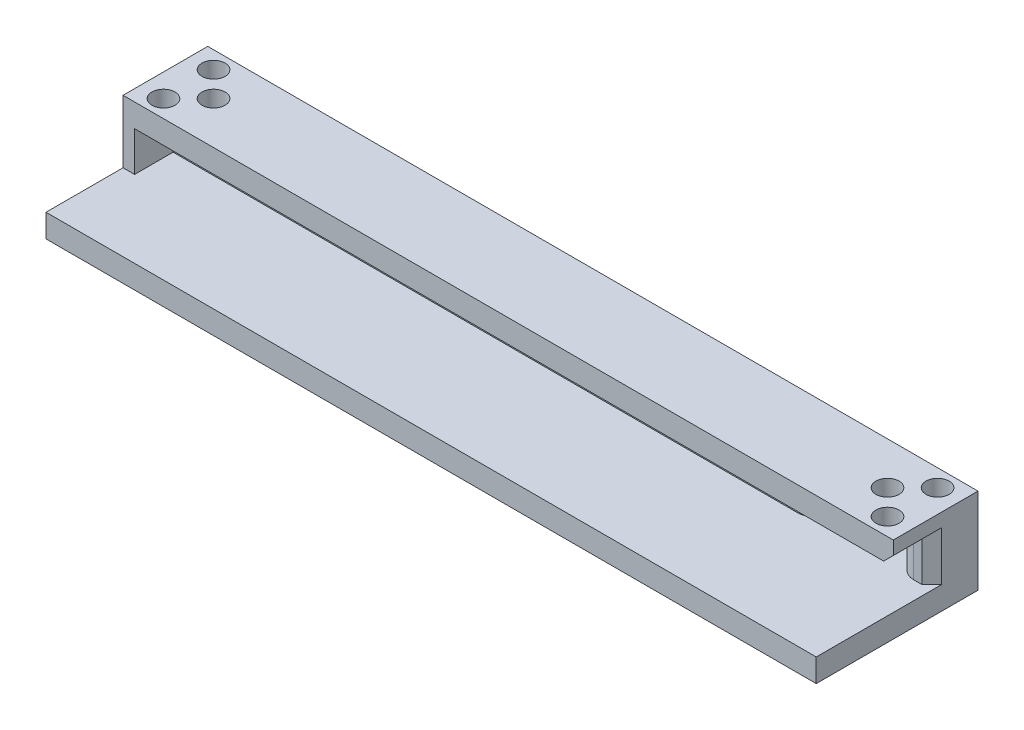
ISO-10303-21;
HEADER;
FILE_DESCRIPTION(('STEP AP214'),'2;1');
FILE_NAME('part.step','',(''),(''),'','','');
FILE_SCHEMA(('AUTOMOTIVE_DESIGN { 1 0 10303 214 1 1 1 1 }'));
ENDSEC;
DATA;
#1=APPLICATION_CONTEXT('core data for automotive mechanical design processes');
#2=APPLICATION_PROTOCOL_DEFINITION('international standard','automotive_design',2000,#1);
#3=PRODUCT_CONTEXT('',#1,'mechanical');
#4=PRODUCT('Part','Part','',(#3));
#5=PRODUCT_RELATED_PRODUCT_CATEGORY('part','',(#4));
#6=PRODUCT_DEFINITION_FORMATION('','',#4);
#7=PRODUCT_DEFINITION_CONTEXT('part definition',#1,'design');
#8=PRODUCT_DEFINITION('design','',#6,#7);
#9=PRODUCT_DEFINITION_SHAPE('','',#8);
#10=(LENGTH_UNIT() NAMED_UNIT(*) SI_UNIT(.MILLI.,.METRE.));
#11=(NAMED_UNIT(*) PLANE_ANGLE_UNIT() SI_UNIT($,.RADIAN.));
#12=(NAMED_UNIT(*) SI_UNIT($,.STERADIAN.) SOLID_ANGLE_UNIT());
#13=UNCERTAINTY_MEASURE_WITH_UNIT(LENGTH_MEASURE(1.E-05),#10,'distance_accuracy_value','');
#14=(GEOMETRIC_REPRESENTATION_CONTEXT(3) GLOBAL_UNCERTAINTY_ASSIGNED_CONTEXT((#13)) GLOBAL_UNIT_ASSIGNED_CONTEXT((#10,
#11,#12)) REPRESENTATION_CONTEXT('',''));
#15=CARTESIAN_POINT('',(0.,0.,0.));
#16=DIRECTION('',(0.,0.,1.));
#17=DIRECTION('',(1.,0.,0.));
#18=AXIS2_PLACEMENT_3D('',#15,#16,#17);
#19=CARTESIAN_POINT('',(50.,2.575,6.));
#20=DIRECTION('',(0.,0.,-1.));
#21=DIRECTION('',(0.,1.,0.));
#22=AXIS2_PLACEMENT_3D('',#19,#20,#21);
#23=PLANE('',#22);
#24=DIRECTION('',(0.,-1.,0.));
#25=VECTOR('',#24,1.);
#26=CARTESIAN_POINT('',(-48.5,2.575,6.));
#27=LINE('',#26,#25);
#28=CARTESIAN_POINT('',(-48.5,2.575,6.));
#29=VERTEX_POINT('',#28);
#30=CARTESIAN_POINT('',(-48.5,-2.57500000000001,6.));
#31=VERTEX_POINT('',#30);
#32=EDGE_CURVE('E163',#29,#31,#27,.T.);
#33=ORIENTED_EDGE('',*,*,#32,.T.);
#34=DIRECTION('',(-1.,0.,0.));
#35=VECTOR('',#34,1.);
#36=CARTESIAN_POINT('',(50.,-2.575,6.));
#37=LINE('',#36,#35);
#38=CARTESIAN_POINT('',(32.6148351928655,-2.575,6.));
#39=VERTEX_POINT('',#38);
#40=EDGE_CURVE('E174',#39,#31,#37,.T.);
#41=ORIENTED_EDGE('',*,*,#40,.F.);
#42=DIRECTION('',(0.,1.,0.));
#43=VECTOR('',#42,1.);
#44=CARTESIAN_POINT('',(32.6148351928655,2.57500000000002,6.));
#45=LINE('',#44,#43);
#46=CARTESIAN_POINT('',(32.6148351928655,2.575,6.));
#47=VERTEX_POINT('',#46);
#48=EDGE_CURVE('E223',#39,#47,#45,.T.);
#49=ORIENTED_EDGE('',*,*,#48,.T.);
#50=DIRECTION('',(-1.,0.,0.));
#51=VECTOR('',#50,1.);
#52=CARTESIAN_POINT('',(50.,2.575,6.));
#53=LINE('',#52,#51);
#54=EDGE_CURVE('E177',#47,#29,#53,.T.);
#55=ORIENTED_EDGE('',*,*,#54,.T.);
#56=EDGE_LOOP('',(#33,#41,#49,#55));
#57=FACE_BOUND('',#56,.T.);
#58=ADVANCED_FACE('F41',(#57),#23,.F.);
#59=CARTESIAN_POINT('',(0.,2.575,0.));
#60=DIRECTION('',(0.,1.,0.));
#61=DIRECTION('',(0.,0.,1.));
#62=AXIS2_PLACEMENT_3D('',#59,#60,#61);
#63=PLANE('',#62);
#64=CARTESIAN_POINT('',(48.75,2.575,6.));
#65=VERTEX_POINT('',#64);
#66=CARTESIAN_POINT('',(47.6262751120219,2.575,6.));
#67=VERTEX_POINT('',#66);
#68=EDGE_CURVE('E187',#65,#67,#53,.T.);
#69=ORIENTED_EDGE('',*,*,#68,.F.);
#70=DIRECTION('',(0.,0.,1.));
#71=VECTOR('',#70,1.);
#72=CARTESIAN_POINT('',(48.75,2.575,11.));
#73=LINE('',#72,#71);
#74=CARTESIAN_POINT('',(48.75,2.575,11.));
#75=VERTEX_POINT('',#74);
#76=EDGE_CURVE('E64',#65,#75,#73,.T.);
#77=ORIENTED_EDGE('',*,*,#76,.T.);
#78=DIRECTION('',(1.,0.,0.));
#79=VECTOR('',#78,1.);
#80=CARTESIAN_POINT('',(-50.,2.575,11.));
#81=LINE('',#80,#79);
#82=CARTESIAN_POINT('',(-48.5,2.575,11.));
#83=VERTEX_POINT('',#82);
#84=EDGE_CURVE('E400',#83,#75,#81,.T.);
#85=ORIENTED_EDGE('',*,*,#84,.F.);
#86=DIRECTION('',(0.,0.,-1.));
#87=VECTOR('',#86,1.);
#88=CARTESIAN_POINT('',(-48.5,2.575,6.));
#89=LINE('',#88,#87);
#90=EDGE_CURVE('E314',#83,#29,#89,.T.);
#91=ORIENTED_EDGE('',*,*,#90,.T.);
#92=ORIENTED_EDGE('',*,*,#54,.F.);
#93=CARTESIAN_POINT('',(32.6148351928655,2.575,4.));
#94=DIRECTION('',(0.,1.,0.));
#95=DIRECTION('',(0.,0.,1.));
#96=AXIS2_PLACEMENT_3D('',#93,#94,#95);
#97=CIRCLE('',#96,2.);
#98=CARTESIAN_POINT('',(33.3576165455737,2.575,5.85695338177052));
#99=VERTEX_POINT('',#98);
#100=EDGE_CURVE('E229',#47,#99,#97,.T.);
#101=ORIENTED_EDGE('',*,*,#100,.T.);
#102=DIRECTION('',(-0.928476690885259,0.,0.371390676354104));
#103=VECTOR('',#102,1.);
#104=CARTESIAN_POINT('',(45.,2.575,1.2));
#105=LINE('',#104,#103);
#106=CARTESIAN_POINT('',(42.7856696828973,2.575,2.08573212684107));
#107=VERTEX_POINT('',#106);
#108=EDGE_CURVE('E425',#107,#99,#105,.T.);
#109=ORIENTED_EDGE('',*,*,#108,.F.);
#110=CARTESIAN_POINT('',(43.5284510356055,2.575,3.94268550861159));
#111=DIRECTION('',(0.,1.,0.));
#112=DIRECTION('',(0.,0.,1.));
#113=AXIS2_PLACEMENT_3D('',#110,#111,#112);
#114=CIRCLE('',#113,2.);
#115=CARTESIAN_POINT('',(45.4864118750807,2.575,3.53477700038759));
#116=VERTEX_POINT('',#115);
#117=EDGE_CURVE('E214',#107,#116,#114,.F.);
#118=ORIENTED_EDGE('',*,*,#117,.T.);
#119=DIRECTION('',(-0.203954254112001,0.,-0.978980419737605));
#120=VECTOR('',#119,1.);
#121=CARTESIAN_POINT('',(46.,2.575,6.));
#122=LINE('',#121,#120);
#123=CARTESIAN_POINT('',(45.6683142725467,2.575,4.40790850822401));
#124=VERTEX_POINT('',#123);
#125=EDGE_CURVE('E429',#124,#116,#122,.T.);
#126=ORIENTED_EDGE('',*,*,#125,.F.);
#127=CARTESIAN_POINT('',(47.6262751120219,2.575,4.));
#128=DIRECTION('',(0.,-1.,0.));
#129=DIRECTION('',(0.,0.,-1.));
#130=AXIS2_PLACEMENT_3D('',#127,#128,#129);
#131=CIRCLE('',#130,2.);
#132=EDGE_CURVE('E198',#124,#67,#131,.F.);
#133=ORIENTED_EDGE('',*,*,#132,.T.);
#134=EDGE_LOOP('',(#69,#77,#85,#91,#92,#101,#109,#118,#126,#133));
#135=FACE_BOUND('',#134,.T.);
#136=ADVANCED_FACE('F253',(#135),#63,.F.);
#137=CARTESIAN_POINT('',(48.75,-2.575,6.));
#138=VERTEX_POINT('',#137);
#139=CARTESIAN_POINT('',(47.6262751120219,-2.575,6.));
#140=VERTEX_POINT('',#139);
#141=EDGE_CURVE('E186',#138,#140,#37,.T.);
#142=ORIENTED_EDGE('',*,*,#141,.F.);
#143=DIRECTION('',(0.,1.,0.));
#144=VECTOR('',#143,1.);
#145=CARTESIAN_POINT('',(48.75,2.575,6.));
#146=LINE('',#145,#144);
#147=EDGE_CURVE('E51',#138,#65,#146,.T.);
#148=ORIENTED_EDGE('',*,*,#147,.T.);
#149=ORIENTED_EDGE('',*,*,#68,.T.);
#150=DIRECTION('',(0.,1.,0.));
#151=VECTOR('',#150,1.);
#152=CARTESIAN_POINT('',(47.6262751120219,2.575,6.));
#153=LINE('',#152,#151);
#154=EDGE_CURVE('E202',#67,#140,#153,.F.);
#155=ORIENTED_EDGE('',*,*,#154,.T.);
#156=EDGE_LOOP('',(#142,#148,#149,#155));
#157=FACE_BOUND('',#156,.T.);
#158=ADVANCED_FACE('F250',(#157),#23,.F.);
#159=CARTESIAN_POINT('',(50.,2.575,0.));
#160=DIRECTION('',(0.,0.,1.));
#161=DIRECTION('',(0.,-1.,0.));
#162=AXIS2_PLACEMENT_3D('',#159,#160,#161);
#163=PLANE('',#162);
#164=DIRECTION('',(0.,1.,0.));
#165=VECTOR('',#164,1.);
#166=CARTESIAN_POINT('',(-50.,2.575,0.));
#167=LINE('',#166,#165);
#168=CARTESIAN_POINT('',(-50.,-5.575,0.));
#169=VERTEX_POINT('',#168);
#170=CARTESIAN_POINT('',(-50.,5.575,0.));
#171=VERTEX_POINT('',#170);
#172=EDGE_CURVE('E440',#169,#171,#167,.T.);
#173=ORIENTED_EDGE('',*,*,#172,.T.);
#174=DIRECTION('',(-1.,0.,0.));
#175=VECTOR('',#174,1.);
#176=CARTESIAN_POINT('',(-50.,5.575,0.));
#177=LINE('',#176,#175);
#178=CARTESIAN_POINT('',(50.,5.575,0.));
#179=VERTEX_POINT('',#178);
#180=EDGE_CURVE('E412',#179,#171,#177,.T.);
#181=ORIENTED_EDGE('',*,*,#180,.F.);
#182=DIRECTION('',(0.,1.,0.));
#183=VECTOR('',#182,1.);
#184=CARTESIAN_POINT('',(50.,2.575,0.));
#185=LINE('',#184,#183);
#186=CARTESIAN_POINT('',(50.,-5.575,0.));
#187=VERTEX_POINT('',#186);
#188=EDGE_CURVE('E441',#187,#179,#185,.T.);
#189=ORIENTED_EDGE('',*,*,#188,.F.);
#190=DIRECTION('',(1.,0.,0.));
#191=VECTOR('',#190,1.);
#192=CARTESIAN_POINT('',(-50.,-5.575,0.));
#193=LINE('',#192,#191);
#194=EDGE_CURVE('E373',#169,#187,#193,.T.);
#195=ORIENTED_EDGE('',*,*,#194,.F.);
#196=EDGE_LOOP('',(#173,#181,#189,#195));
#197=FACE_BOUND('',#196,.T.);
#198=ADVANCED_FACE('F447',(#197),#163,.F.);
#199=CARTESIAN_POINT('',(50.,0.,0.));
#200=DIRECTION('',(1.,0.,0.));
#201=DIRECTION('',(0.,0.,-1.));
#202=AXIS2_PLACEMENT_3D('',#199,#200,#201);
#203=PLANE('',#202);
#204=DIRECTION('',(0.,-1.,0.));
#205=VECTOR('',#204,1.);
#206=CARTESIAN_POINT('',(50.,5.575,11.));
#207=LINE('',#206,#205);
#208=CARTESIAN_POINT('',(50.,5.575,11.));
#209=VERTEX_POINT('',#208);
#210=CARTESIAN_POINT('',(50.,3.82500000000001,11.));
#211=VERTEX_POINT('',#210);
#212=EDGE_CURVE('E416',#209,#211,#207,.T.);
#213=ORIENTED_EDGE('',*,*,#212,.T.);
#214=DIRECTION('',(0.,0.,-1.));
#215=VECTOR('',#214,1.);
#216=CARTESIAN_POINT('',(50.,3.82500000000001,6.));
#217=LINE('',#216,#215);
#218=CARTESIAN_POINT('',(50.,3.82500000000001,4.74999999999999));
#219=VERTEX_POINT('',#218);
#220=EDGE_CURVE('E238',#211,#219,#217,.T.);
#221=ORIENTED_EDGE('',*,*,#220,.T.);
#222=DIRECTION('',(0.,-1.,0.));
#223=VECTOR('',#222,1.);
#224=CARTESIAN_POINT('',(50.,-2.575,4.74999999999998));
#225=LINE('',#224,#223);
#226=CARTESIAN_POINT('',(50.,-2.575,4.74999999999998));
#227=VERTEX_POINT('',#226);
#228=EDGE_CURVE('E234',#219,#227,#225,.T.);
#229=ORIENTED_EDGE('',*,*,#228,.T.);
#230=DIRECTION('',(0.,0.,1.));
#231=VECTOR('',#230,1.);
#232=CARTESIAN_POINT('',(50.,-2.575,0.));
#233=LINE('',#232,#231);
#234=CARTESIAN_POINT('',(50.,-2.57500000000001,21.));
#235=VERTEX_POINT('',#234);
#236=EDGE_CURVE('E388',#227,#235,#233,.T.);
#237=ORIENTED_EDGE('',*,*,#236,.T.);
#238=DIRECTION('',(0.,1.,0.));
#239=VECTOR('',#238,1.);
#240=CARTESIAN_POINT('',(50.,-5.57500000000001,21.));
#241=LINE('',#240,#239);
#242=CARTESIAN_POINT('',(50.,-5.57500000000001,21.));
#243=VERTEX_POINT('',#242);
#244=EDGE_CURVE('E396',#243,#235,#241,.T.);
#245=ORIENTED_EDGE('',*,*,#244,.F.);
#246=DIRECTION('',(0.,0.,1.));
#247=VECTOR('',#246,1.);
#248=CARTESIAN_POINT('',(50.,-5.575,0.));
#249=LINE('',#248,#247);
#250=EDGE_CURVE('E378',#187,#243,#249,.T.);
#251=ORIENTED_EDGE('',*,*,#250,.F.);
#252=ORIENTED_EDGE('',*,*,#188,.T.);
#253=DIRECTION('',(0.,0.,-1.));
#254=VECTOR('',#253,1.);
#255=CARTESIAN_POINT('',(50.,5.575,0.));
#256=LINE('',#255,#254);
#257=EDGE_CURVE('E408',#209,#179,#256,.T.);
#258=ORIENTED_EDGE('',*,*,#257,.F.);
#259=EDGE_LOOP('',(#213,#221,#229,#237,#245,#251,#252,#258));
#260=FACE_BOUND('',#259,.T.);
#261=ADVANCED_FACE('F470',(#260),#203,.T.);
#262=CARTESIAN_POINT('',(-50.,0.,0.));
#263=DIRECTION('',(1.,0.,0.));
#264=DIRECTION('',(0.,0.,-1.));
#265=AXIS2_PLACEMENT_3D('',#262,#263,#264);
#266=PLANE('',#265);
#267=DIRECTION('',(0.,0.,-1.));
#268=VECTOR('',#267,1.);
#269=CARTESIAN_POINT('',(-50.,-2.575,0.));
#270=LINE('',#269,#268);
#271=CARTESIAN_POINT('',(-50.,-2.57500000000001,21.));
#272=VERTEX_POINT('',#271);
#273=CARTESIAN_POINT('',(-50.,-2.57500000000001,11.));
#274=VERTEX_POINT('',#273);
#275=EDGE_CURVE('E365',#272,#274,#270,.T.);
#276=ORIENTED_EDGE('',*,*,#275,.T.);
#277=DIRECTION('',(0.,-1.,0.));
#278=VECTOR('',#277,1.);
#279=CARTESIAN_POINT('',(-50.,5.575,11.));
#280=LINE('',#279,#278);
#281=CARTESIAN_POINT('',(-50.,5.575,11.));
#282=VERTEX_POINT('',#281);
#283=EDGE_CURVE('E422',#282,#274,#280,.T.);
#284=ORIENTED_EDGE('',*,*,#283,.F.);
#285=DIRECTION('',(0.,0.,1.));
#286=VECTOR('',#285,1.);
#287=CARTESIAN_POINT('',(-50.,5.575,0.));
#288=LINE('',#287,#286);
#289=EDGE_CURVE('E401',#171,#282,#288,.T.);
#290=ORIENTED_EDGE('',*,*,#289,.F.);
#291=ORIENTED_EDGE('',*,*,#172,.F.);
#292=DIRECTION('',(0.,0.,-1.));
#293=VECTOR('',#292,1.);
#294=CARTESIAN_POINT('',(-50.,-5.575,0.));
#295=LINE('',#294,#293);
#296=CARTESIAN_POINT('',(-50.,-5.57500000000001,21.));
#297=VERTEX_POINT('',#296);
#298=EDGE_CURVE('E369',#297,#169,#295,.T.);
#299=ORIENTED_EDGE('',*,*,#298,.F.);
#300=DIRECTION('',(0.,1.,0.));
#301=VECTOR('',#300,1.);
#302=CARTESIAN_POINT('',(-50.,-5.57500000000001,21.));
#303=LINE('',#302,#301);
#304=EDGE_CURVE('E384',#297,#272,#303,.T.);
#305=ORIENTED_EDGE('',*,*,#304,.T.);
#306=EDGE_LOOP('',(#276,#284,#290,#291,#299,#305));
#307=FACE_BOUND('',#306,.T.);
#308=ADVANCED_FACE('F455',(#307),#266,.F.);
#309=CARTESIAN_POINT('',(45.,-7.425,1.19999999999999));
#310=DIRECTION('',(-0.371390676354104,0.,-0.928476690885259));
#311=DIRECTION('',(-0.928476690885259,0.,0.371390676354104));
#312=AXIS2_PLACEMENT_3D('',#309,#310,#311);
#313=PLANE('',#312);
#314=ORIENTED_EDGE('',*,*,#108,.T.);
#315=DIRECTION('',(0.,1.,0.));
#316=VECTOR('',#315,1.);
#317=CARTESIAN_POINT('',(33.3576165455737,-7.42499999999999,5.85695338177052));
#318=LINE('',#317,#316);
#319=CARTESIAN_POINT('',(33.3576165455737,-2.575,5.85695338177052));
#320=VERTEX_POINT('',#319);
#321=EDGE_CURVE('E226',#99,#320,#318,.F.);
#322=ORIENTED_EDGE('',*,*,#321,.T.);
#323=DIRECTION('',(-0.928476690885259,0.,0.371390676354104));
#324=VECTOR('',#323,1.);
#325=CARTESIAN_POINT('',(47.6551724137931,-2.575,0.137931034482755));
#326=LINE('',#325,#324);
#327=CARTESIAN_POINT('',(42.7856696828973,-2.575,2.08573212684107));
#328=VERTEX_POINT('',#327);
#329=EDGE_CURVE('E437',#328,#320,#326,.T.);
#330=ORIENTED_EDGE('',*,*,#329,.F.);
#331=DIRECTION('',(0.,1.,0.));
#332=VECTOR('',#331,1.);
#333=CARTESIAN_POINT('',(42.7856696828973,2.575,2.08573212684107));
#334=LINE('',#333,#332);
#335=EDGE_CURVE('E210',#328,#107,#334,.T.);
#336=ORIENTED_EDGE('',*,*,#335,.T.);
#337=EDGE_LOOP('',(#314,#322,#330,#336));
#338=FACE_BOUND('',#337,.T.);
#339=ADVANCED_FACE('F476',(#338),#313,.F.);
#340=CARTESIAN_POINT('',(46.,-7.425,5.99999999999999));
#341=DIRECTION('',(0.978980419737605,0.,-0.203954254112001));
#342=DIRECTION('',(-0.203954254112001,0.,-0.978980419737605));
#343=AXIS2_PLACEMENT_3D('',#340,#341,#342);
#344=PLANE('',#343);
#345=ORIENTED_EDGE('',*,*,#125,.T.);
#346=DIRECTION('',(0.,1.,0.));
#347=VECTOR('',#346,1.);
#348=CARTESIAN_POINT('',(45.4864118750807,-2.575,3.53477700038758));
#349=LINE('',#348,#347);
#350=CARTESIAN_POINT('',(45.4864118750807,-2.575,3.53477700038758));
#351=VERTEX_POINT('',#350);
#352=EDGE_CURVE('E217',#116,#351,#349,.F.);
#353=ORIENTED_EDGE('',*,*,#352,.T.);
#354=DIRECTION('',(-0.203954254112001,0.,-0.978980419737605));
#355=VECTOR('',#354,1.);
#356=CARTESIAN_POINT('',(46.1663893510815,-2.575,6.79866888519135));
#357=LINE('',#356,#355);
#358=CARTESIAN_POINT('',(45.6683142725467,-2.575,4.407908508224));
#359=VERTEX_POINT('',#358);
#360=EDGE_CURVE('E433',#359,#351,#357,.T.);
#361=ORIENTED_EDGE('',*,*,#360,.F.);
#362=DIRECTION('',(0.,1.,0.));
#363=VECTOR('',#362,1.);
#364=CARTESIAN_POINT('',(45.6683142725467,-7.425,4.407908508224));
#365=LINE('',#364,#363);
#366=EDGE_CURVE('E191',#359,#124,#365,.T.);
#367=ORIENTED_EDGE('',*,*,#366,.T.);
#368=EDGE_LOOP('',(#345,#353,#361,#367));
#369=FACE_BOUND('',#368,.T.);
#370=ADVANCED_FACE('F514',(#369),#344,.F.);
#371=CARTESIAN_POINT('',(47.6262751120219,-7.425,4.));
#372=DIRECTION('',(0.,1.,0.));
#373=DIRECTION('',(0.,0.,1.));
#374=AXIS2_PLACEMENT_3D('',#371,#372,#373);
#375=CYLINDRICAL_SURFACE('',#374,2.);
#376=CARTESIAN_POINT('',(47.6262751120219,-2.575,4.));
#377=DIRECTION('',(0.,1.,0.));
#378=DIRECTION('',(0.,0.,1.));
#379=AXIS2_PLACEMENT_3D('',#376,#377,#378);
#380=CIRCLE('',#379,2.);
#381=EDGE_CURVE('E206',#140,#359,#380,.F.);
#382=ORIENTED_EDGE('',*,*,#381,.F.);
#383=ORIENTED_EDGE('',*,*,#154,.F.);
#384=ORIENTED_EDGE('',*,*,#132,.F.);
#385=ORIENTED_EDGE('',*,*,#366,.F.);
#386=EDGE_LOOP('',(#382,#383,#384,#385));
#387=FACE_BOUND('',#386,.T.);
#388=ADVANCED_FACE('F517',(#387),#375,.T.);
#389=CARTESIAN_POINT('',(-50.,5.575,11.));
#390=DIRECTION('',(0.,0.,-1.));
#391=DIRECTION('',(0.,1.,0.));
#392=AXIS2_PLACEMENT_3D('',#389,#390,#391);
#393=PLANE('',#392);
#394=ORIENTED_EDGE('',*,*,#84,.T.);
#395=DIRECTION('',(0.707106781186548,0.707106781186548,0.));
#396=VECTOR('',#395,1.);
#397=CARTESIAN_POINT('',(50.,3.82500000000001,11.));
#398=LINE('',#397,#396);
#399=EDGE_CURVE('E244',#75,#211,#398,.T.);
#400=ORIENTED_EDGE('',*,*,#399,.T.);
#401=ORIENTED_EDGE('',*,*,#212,.F.);
#402=DIRECTION('',(1.,0.,0.));
#403=VECTOR('',#402,1.);
#404=CARTESIAN_POINT('',(-50.,5.575,11.));
#405=LINE('',#404,#403);
#406=EDGE_CURVE('E405',#282,#209,#405,.T.);
#407=ORIENTED_EDGE('',*,*,#406,.F.);
#408=ORIENTED_EDGE('',*,*,#283,.T.);
#409=DIRECTION('',(-1.,0.,0.));
#410=VECTOR('',#409,1.);
#411=CARTESIAN_POINT('',(-48.5,-2.57500000000001,11.));
#412=LINE('',#411,#410);
#413=CARTESIAN_POINT('',(-48.5,-2.57500000000001,11.));
#414=VERTEX_POINT('',#413);
#415=EDGE_CURVE('E317',#414,#274,#412,.T.);
#416=ORIENTED_EDGE('',*,*,#415,.F.);
#417=DIRECTION('',(0.,1.,0.));
#418=VECTOR('',#417,1.);
#419=CARTESIAN_POINT('',(-48.5,2.575,11.));
#420=LINE('',#419,#418);
#421=EDGE_CURVE('E165',#414,#83,#420,.T.);
#422=ORIENTED_EDGE('',*,*,#421,.T.);
#423=EDGE_LOOP('',(#394,#400,#401,#407,#408,#416,#422));
#424=FACE_BOUND('',#423,.T.);
#425=ADVANCED_FACE('F458',(#424),#393,.F.);
#426=CARTESIAN_POINT('',(0.,5.575,0.));
#427=DIRECTION('',(0.,1.,0.));
#428=DIRECTION('',(0.,0.,1.));
#429=AXIS2_PLACEMENT_3D('',#426,#427,#428);
#430=PLANE('',#429);
#431=CARTESIAN_POINT('',(-47.,5.575,2.25));
#432=DIRECTION('',(0.,1.,0.));
#433=DIRECTION('',(0.,0.,1.));
#434=AXIS2_PLACEMENT_3D('',#431,#432,#433);
#435=CIRCLE('',#434,1.5);
#436=CARTESIAN_POINT('',(-47.,5.575,3.75));
#437=VERTEX_POINT('',#436);
#438=EDGE_CURVE('E334',#437,#437,#435,.T.);
#439=ORIENTED_EDGE('',*,*,#438,.F.);
#440=EDGE_LOOP('',(#439));
#441=FACE_BOUND('',#440,.T.);
#442=CARTESIAN_POINT('',(-47.,5.575,8.75));
#443=DIRECTION('',(0.,1.,0.));
#444=DIRECTION('',(0.,0.,-1.));
#445=AXIS2_PLACEMENT_3D('',#442,#443,#444);
#446=CIRCLE('',#445,1.5);
#447=CARTESIAN_POINT('',(-47.,5.575,7.25));
#448=VERTEX_POINT('',#447);
#449=EDGE_CURVE('E342',#448,#448,#446,.T.);
#450=ORIENTED_EDGE('',*,*,#449,.F.);
#451=EDGE_LOOP('',(#450));
#452=FACE_BOUND('',#451,.T.);
#453=CARTESIAN_POINT('',(47.,5.575,8.74999999999996));
#454=DIRECTION('',(0.,1.,0.));
#455=DIRECTION('',(0.,0.,1.));
#456=AXIS2_PLACEMENT_3D('',#453,#454,#455);
#457=CIRCLE('',#456,1.49999999999999);
#458=CARTESIAN_POINT('',(47.,5.575,10.2499999999999));
#459=VERTEX_POINT('',#458);
#460=EDGE_CURVE('E350',#459,#459,#457,.T.);
#461=ORIENTED_EDGE('',*,*,#460,.F.);
#462=EDGE_LOOP('',(#461));
#463=FACE_BOUND('',#462,.T.);
#464=CARTESIAN_POINT('',(47.,5.575,2.24999999999996));
#465=DIRECTION('',(0.,1.,0.));
#466=DIRECTION('',(0.,0.,-1.));
#467=AXIS2_PLACEMENT_3D('',#464,#465,#466);
#468=CIRCLE('',#467,1.49999999999999);
#469=CARTESIAN_POINT('',(47.,5.575,0.749999999999966));
#470=VERTEX_POINT('',#469);
#471=EDGE_CURVE('E325',#470,#470,#468,.T.);
#472=ORIENTED_EDGE('',*,*,#471,.F.);
#473=EDGE_LOOP('',(#472));
#474=FACE_BOUND('',#473,.T.);
#475=CARTESIAN_POINT('',(43.75,5.575,5.49999999999999));
#476=DIRECTION('',(0.,1.,0.));
#477=DIRECTION('',(0.,0.,-1.));
#478=AXIS2_PLACEMENT_3D('',#475,#476,#477);
#479=CIRCLE('',#478,1.49999999999999);
#480=CARTESIAN_POINT('',(43.75,5.575,4.));
#481=VERTEX_POINT('',#480);
#482=EDGE_CURVE('E320',#481,#481,#479,.T.);
#483=ORIENTED_EDGE('',*,*,#482,.F.);
#484=EDGE_LOOP('',(#483));
#485=FACE_BOUND('',#484,.T.);
#486=CARTESIAN_POINT('',(-43.75,5.575,5.5));
#487=DIRECTION('',(0.,1.,0.));
#488=DIRECTION('',(0.,0.,1.));
#489=AXIS2_PLACEMENT_3D('',#486,#487,#488);
#490=CIRCLE('',#489,1.5);
#491=CARTESIAN_POINT('',(-43.75,5.575,7.));
#492=VERTEX_POINT('',#491);
#493=EDGE_CURVE('E333',#492,#492,#490,.T.);
#494=ORIENTED_EDGE('',*,*,#493,.F.);
#495=EDGE_LOOP('',(#494));
#496=FACE_BOUND('',#495,.T.);
#497=ORIENTED_EDGE('',*,*,#289,.T.);
#498=ORIENTED_EDGE('',*,*,#406,.T.);
#499=ORIENTED_EDGE('',*,*,#257,.T.);
#500=ORIENTED_EDGE('',*,*,#180,.T.);
#501=EDGE_LOOP('',(#497,#498,#499,#500));
#502=FACE_BOUND('',#501,.T.);
#503=ADVANCED_FACE('F452',(#441,#452,#463,#474,#485,#496,#502),#430,.T.);
#504=CARTESIAN_POINT('',(-50.,-5.57500000000001,21.));
#505=DIRECTION('',(0.,0.,-1.));
#506=DIRECTION('',(0.,1.,0.));
#507=AXIS2_PLACEMENT_3D('',#504,#505,#506);
#508=PLANE('',#507);
#509=DIRECTION('',(-1.,0.,0.));
#510=VECTOR('',#509,1.);
#511=CARTESIAN_POINT('',(-50.,-2.57500000000001,21.));
#512=LINE('',#511,#510);
#513=EDGE_CURVE('E374',#235,#272,#512,.T.);
#514=ORIENTED_EDGE('',*,*,#513,.T.);
#515=ORIENTED_EDGE('',*,*,#304,.F.);
#516=DIRECTION('',(-1.,0.,0.));
#517=VECTOR('',#516,1.);
#518=CARTESIAN_POINT('',(-50.,-5.57500000000001,21.));
#519=LINE('',#518,#517);
#520=EDGE_CURVE('E381',#243,#297,#519,.T.);
#521=ORIENTED_EDGE('',*,*,#520,.F.);
#522=ORIENTED_EDGE('',*,*,#244,.T.);
#523=EDGE_LOOP('',(#514,#515,#521,#522));
#524=FACE_BOUND('',#523,.T.);
#525=ADVANCED_FACE('F463',(#524),#508,.F.);
#526=CARTESIAN_POINT('',(0.,-5.575,0.));
#527=DIRECTION('',(0.,1.,0.));
#528=DIRECTION('',(0.,0.,1.));
#529=AXIS2_PLACEMENT_3D('',#526,#527,#528);
#530=PLANE('',#529);
#531=CARTESIAN_POINT('',(43.75,-5.575,5.49999999999999));
#532=DIRECTION('',(0.,-1.,0.));
#533=DIRECTION('',(0.,0.,-1.));
#534=AXIS2_PLACEMENT_3D('',#531,#532,#533);
#535=CIRCLE('',#534,1.49999999999999);
#536=CARTESIAN_POINT('',(43.75,-5.575,4.));
#537=VERTEX_POINT('',#536);
#538=EDGE_CURVE('E279',#537,#537,#535,.T.);
#539=ORIENTED_EDGE('',*,*,#538,.F.);
#540=EDGE_LOOP('',(#539));
#541=FACE_BOUND('',#540,.T.);
#542=CARTESIAN_POINT('',(47.,-5.575,2.24999999999995));
#543=DIRECTION('',(0.,-1.,0.));
#544=DIRECTION('',(0.,0.,-1.));
#545=AXIS2_PLACEMENT_3D('',#542,#543,#544);
#546=CIRCLE('',#545,1.49999999999999);
#547=CARTESIAN_POINT('',(47.,-5.575,0.749999999999964));
#548=VERTEX_POINT('',#547);
#549=EDGE_CURVE('E287',#548,#548,#546,.T.);
#550=ORIENTED_EDGE('',*,*,#549,.F.);
#551=EDGE_LOOP('',(#550));
#552=FACE_BOUND('',#551,.T.);
#553=CARTESIAN_POINT('',(-47.,-5.575,8.75));
#554=DIRECTION('',(0.,-1.,0.));
#555=DIRECTION('',(0.,0.,-1.));
#556=AXIS2_PLACEMENT_3D('',#553,#554,#555);
#557=CIRCLE('',#556,1.5);
#558=CARTESIAN_POINT('',(-47.,-5.575,7.25));
#559=VERTEX_POINT('',#558);
#560=EDGE_CURVE('E295',#559,#559,#557,.T.);
#561=ORIENTED_EDGE('',*,*,#560,.F.);
#562=EDGE_LOOP('',(#561));
#563=FACE_BOUND('',#562,.T.);
#564=CARTESIAN_POINT('',(-43.75,-5.575,5.5));
#565=DIRECTION('',(0.,-1.,0.));
#566=DIRECTION('',(0.,0.,-1.));
#567=AXIS2_PLACEMENT_3D('',#564,#565,#566);
#568=CIRCLE('',#567,1.5);
#569=CARTESIAN_POINT('',(-43.75,-5.575,3.99999999999999));
#570=VERTEX_POINT('',#569);
#571=EDGE_CURVE('E271',#570,#570,#568,.T.);
#572=ORIENTED_EDGE('',*,*,#571,.F.);
#573=EDGE_LOOP('',(#572));
#574=FACE_BOUND('',#573,.T.);
#575=CARTESIAN_POINT('',(-47.,-5.575,2.25));
#576=DIRECTION('',(0.,-1.,0.));
#577=DIRECTION('',(0.,0.,-1.));
#578=AXIS2_PLACEMENT_3D('',#575,#576,#577);
#579=CIRCLE('',#578,1.5);
#580=CARTESIAN_POINT('',(-47.,-5.575,0.749999999999994));
#581=VERTEX_POINT('',#580);
#582=EDGE_CURVE('E262',#581,#581,#579,.T.);
#583=ORIENTED_EDGE('',*,*,#582,.F.);
#584=EDGE_LOOP('',(#583));
#585=FACE_BOUND('',#584,.T.);
#586=CARTESIAN_POINT('',(47.,-5.575,8.74999999999995));
#587=DIRECTION('',(0.,-1.,0.));
#588=DIRECTION('',(0.,0.,-1.));
#589=AXIS2_PLACEMENT_3D('',#586,#587,#588);
#590=CIRCLE('',#589,1.49999999999999);
#591=CARTESIAN_POINT('',(47.,-5.575,7.24999999999996));
#592=VERTEX_POINT('',#591);
#593=EDGE_CURVE('E278',#592,#592,#590,.T.);
#594=ORIENTED_EDGE('',*,*,#593,.F.);
#595=EDGE_LOOP('',(#594));
#596=FACE_BOUND('',#595,.T.);
#597=ORIENTED_EDGE('',*,*,#298,.T.);
#598=ORIENTED_EDGE('',*,*,#194,.T.);
#599=ORIENTED_EDGE('',*,*,#250,.T.);
#600=ORIENTED_EDGE('',*,*,#520,.T.);
#601=EDGE_LOOP('',(#597,#598,#599,#600));
#602=FACE_BOUND('',#601,.T.);
#603=ADVANCED_FACE('F467',(#541,#552,#563,#574,#585,#596,#602),#530,.F.);
#604=CARTESIAN_POINT('',(0.,-2.575,0.));
#605=DIRECTION('',(0.,1.,0.));
#606=DIRECTION('',(0.,0.,1.));
#607=AXIS2_PLACEMENT_3D('',#604,#605,#606);
#608=PLANE('',#607);
#609=ORIENTED_EDGE('',*,*,#415,.T.);
#610=ORIENTED_EDGE('',*,*,#275,.F.);
#611=ORIENTED_EDGE('',*,*,#513,.F.);
#612=ORIENTED_EDGE('',*,*,#236,.F.);
#613=DIRECTION('',(-0.707106781186548,0.,0.707106781186548));
#614=VECTOR('',#613,1.);
#615=CARTESIAN_POINT('',(50.,-2.575,4.74999999999998));
#616=LINE('',#615,#614);
#617=EDGE_CURVE('E11',#227,#138,#616,.T.);
#618=ORIENTED_EDGE('',*,*,#617,.T.);
#619=ORIENTED_EDGE('',*,*,#141,.T.);
#620=ORIENTED_EDGE('',*,*,#381,.T.);
#621=ORIENTED_EDGE('',*,*,#360,.T.);
#622=CARTESIAN_POINT('',(43.5284510356055,-2.575,3.94268550861159));
#623=DIRECTION('',(0.,1.,0.));
#624=DIRECTION('',(0.,0.,1.));
#625=AXIS2_PLACEMENT_3D('',#622,#623,#624);
#626=CIRCLE('',#625,2.);
#627=EDGE_CURVE('E220',#351,#328,#626,.T.);
#628=ORIENTED_EDGE('',*,*,#627,.T.);
#629=ORIENTED_EDGE('',*,*,#329,.T.);
#630=CARTESIAN_POINT('',(32.6148351928655,-2.575,4.));
#631=DIRECTION('',(0.,1.,0.));
#632=DIRECTION('',(0.,0.,1.));
#633=AXIS2_PLACEMENT_3D('',#630,#631,#632);
#634=CIRCLE('',#633,2.);
#635=EDGE_CURVE('E184',#320,#39,#634,.F.);
#636=ORIENTED_EDGE('',*,*,#635,.T.);
#637=ORIENTED_EDGE('',*,*,#40,.T.);
#638=DIRECTION('',(0.,0.,1.));
#639=VECTOR('',#638,1.);
#640=CARTESIAN_POINT('',(-48.5,-2.57500000000001,6.));
#641=LINE('',#640,#639);
#642=EDGE_CURVE('E159',#31,#414,#641,.T.);
#643=ORIENTED_EDGE('',*,*,#642,.T.);
#644=EDGE_LOOP('',(#609,#610,#611,#612,#618,#619,#620,#621,#628,#629,#636,#637,#643));
#645=FACE_BOUND('',#644,.T.);
#646=ADVANCED_FACE('F181',(#645),#608,.T.);
#647=CARTESIAN_POINT('',(43.5284510356055,-7.425,3.94268550861158));
#648=DIRECTION('',(0.,-1.,0.));
#649=DIRECTION('',(0.,0.,-1.));
#650=AXIS2_PLACEMENT_3D('',#647,#648,#649);
#651=CYLINDRICAL_SURFACE('',#650,2.);
#652=ORIENTED_EDGE('',*,*,#627,.F.);
#653=ORIENTED_EDGE('',*,*,#352,.F.);
#654=ORIENTED_EDGE('',*,*,#117,.F.);
#655=ORIENTED_EDGE('',*,*,#335,.F.);
#656=EDGE_LOOP('',(#652,#653,#654,#655));
#657=FACE_BOUND('',#656,.T.);
#658=ADVANCED_FACE('F482',(#657),#651,.F.);
#659=CARTESIAN_POINT('',(32.6148351928655,2.57500000000002,4.));
#660=DIRECTION('',(0.,1.,0.));
#661=DIRECTION('',(-1.,0.,0.));
#662=AXIS2_PLACEMENT_3D('',#659,#660,#661);
#663=CYLINDRICAL_SURFACE('',#662,2.);
#664=ORIENTED_EDGE('',*,*,#635,.F.);
#665=ORIENTED_EDGE('',*,*,#321,.F.);
#666=ORIENTED_EDGE('',*,*,#100,.F.);
#667=ORIENTED_EDGE('',*,*,#48,.F.);
#668=EDGE_LOOP('',(#664,#665,#666,#667));
#669=FACE_BOUND('',#668,.T.);
#670=ADVANCED_FACE('F479',(#669),#663,.T.);
#671=CARTESIAN_POINT('',(-43.75,2.825,5.5));
#672=DIRECTION('',(0.,1.,0.));
#673=DIRECTION('',(0.,0.,1.));
#674=AXIS2_PLACEMENT_3D('',#671,#672,#673);
#675=CYLINDRICAL_SURFACE('',#674,1.5);
#676=CARTESIAN_POINT('',(-43.75,2.825,5.5));
#677=DIRECTION('',(0.,1.,0.));
#678=DIRECTION('',(0.,0.,1.));
#679=AXIS2_PLACEMENT_3D('',#676,#677,#678);
#680=CIRCLE('',#679,1.5);
#681=CARTESIAN_POINT('',(-43.75,2.825,7.));
#682=VERTEX_POINT('',#681);
#683=EDGE_CURVE('E361',#682,#682,#680,.T.);
#684=ORIENTED_EDGE('',*,*,#683,.F.);
#685=EDGE_LOOP('',(#684));
#686=FACE_BOUND('',#685,.T.);
#687=ORIENTED_EDGE('',*,*,#493,.T.);
#688=EDGE_LOOP('',(#687));
#689=FACE_BOUND('',#688,.T.);
#690=ADVANCED_FACE('F481',(#686,#689),#675,.F.);
#691=CARTESIAN_POINT('',(-43.75,2.825,5.5));
#692=DIRECTION('',(0.,1.,0.));
#693=DIRECTION('',(0.,0.,1.));
#694=AXIS2_PLACEMENT_3D('',#691,#692,#693);
#695=PLANE('',#694);
#696=ORIENTED_EDGE('',*,*,#683,.T.);
#697=EDGE_LOOP('',(#696));
#698=FACE_BOUND('',#697,.T.);
#699=ADVANCED_FACE('F488',(#698),#695,.T.);
#700=CARTESIAN_POINT('',(43.75,2.825,5.49999999999999));
#701=DIRECTION('',(0.,1.,0.));
#702=DIRECTION('',(0.,0.,1.));
#703=AXIS2_PLACEMENT_3D('',#700,#701,#702);
#704=CYLINDRICAL_SURFACE('',#703,1.49999999999999);
#705=CARTESIAN_POINT('',(43.75,2.825,5.49999999999999));
#706=DIRECTION('',(0.,1.,0.));
#707=DIRECTION('',(0.,0.,-1.));
#708=AXIS2_PLACEMENT_3D('',#705,#706,#707);
#709=CIRCLE('',#708,1.49999999999999);
#710=CARTESIAN_POINT('',(43.75,2.825,4.));
#711=VERTEX_POINT('',#710);
#712=EDGE_CURVE('E321',#711,#711,#709,.T.);
#713=ORIENTED_EDGE('',*,*,#712,.F.);
#714=EDGE_LOOP('',(#713));
#715=FACE_BOUND('',#714,.T.);
#716=ORIENTED_EDGE('',*,*,#482,.T.);
#717=EDGE_LOOP('',(#716));
#718=FACE_BOUND('',#717,.T.);
#719=ADVANCED_FACE('F533',(#715,#718),#704,.F.);
#720=CARTESIAN_POINT('',(43.75,2.825,5.49999999999999));
#721=DIRECTION('',(0.,-1.,0.));
#722=DIRECTION('',(0.,0.,-1.));
#723=AXIS2_PLACEMENT_3D('',#720,#721,#722);
#724=PLANE('',#723);
#725=ORIENTED_EDGE('',*,*,#712,.T.);
#726=EDGE_LOOP('',(#725));
#727=FACE_BOUND('',#726,.T.);
#728=ADVANCED_FACE('F539',(#727),#724,.F.);
#729=CARTESIAN_POINT('',(47.,2.825,2.24999999999996));
#730=DIRECTION('',(0.,1.,0.));
#731=DIRECTION('',(0.,0.,1.));
#732=AXIS2_PLACEMENT_3D('',#729,#730,#731);
#733=CYLINDRICAL_SURFACE('',#732,1.49999999999999);
#734=CARTESIAN_POINT('',(47.,2.825,2.24999999999996));
#735=DIRECTION('',(0.,1.,0.));
#736=DIRECTION('',(0.,0.,-1.));
#737=AXIS2_PLACEMENT_3D('',#734,#735,#736);
#738=CIRCLE('',#737,1.49999999999999);
#739=CARTESIAN_POINT('',(47.,2.825,0.749999999999965));
#740=VERTEX_POINT('',#739);
#741=EDGE_CURVE('E354',#740,#740,#738,.T.);
#742=ORIENTED_EDGE('',*,*,#741,.F.);
#743=EDGE_LOOP('',(#742));
#744=FACE_BOUND('',#743,.T.);
#745=ORIENTED_EDGE('',*,*,#471,.T.);
#746=EDGE_LOOP('',(#745));
#747=FACE_BOUND('',#746,.T.);
#748=ADVANCED_FACE('F535',(#744,#747),#733,.F.);
#749=CARTESIAN_POINT('',(47.,2.825,2.24999999999996));
#750=DIRECTION('',(0.,-1.,0.));
#751=DIRECTION('',(0.,0.,-1.));
#752=AXIS2_PLACEMENT_3D('',#749,#750,#751);
#753=PLANE('',#752);
#754=ORIENTED_EDGE('',*,*,#741,.T.);
#755=EDGE_LOOP('',(#754));
#756=FACE_BOUND('',#755,.T.);
#757=ADVANCED_FACE('F538',(#756),#753,.F.);
#758=CARTESIAN_POINT('',(47.,2.825,8.74999999999996));
#759=DIRECTION('',(0.,1.,0.));
#760=DIRECTION('',(0.,0.,1.));
#761=AXIS2_PLACEMENT_3D('',#758,#759,#760);
#762=CYLINDRICAL_SURFACE('',#761,1.49999999999999);
#763=CARTESIAN_POINT('',(47.,2.825,8.74999999999996));
#764=DIRECTION('',(0.,1.,0.));
#765=DIRECTION('',(0.,0.,1.));
#766=AXIS2_PLACEMENT_3D('',#763,#764,#765);
#767=CIRCLE('',#766,1.49999999999999);
#768=CARTESIAN_POINT('',(47.,2.825,10.2499999999999));
#769=VERTEX_POINT('',#768);
#770=EDGE_CURVE('E346',#769,#769,#767,.T.);
#771=ORIENTED_EDGE('',*,*,#770,.F.);
#772=EDGE_LOOP('',(#771));
#773=FACE_BOUND('',#772,.T.);
#774=ORIENTED_EDGE('',*,*,#460,.T.);
#775=EDGE_LOOP('',(#774));
#776=FACE_BOUND('',#775,.T.);
#777=ADVANCED_FACE('F543',(#773,#776),#762,.F.);
#778=CARTESIAN_POINT('',(47.,2.825,8.74999999999996));
#779=DIRECTION('',(0.,1.,0.));
#780=DIRECTION('',(0.,0.,1.));
#781=AXIS2_PLACEMENT_3D('',#778,#779,#780);
#782=PLANE('',#781);
#783=ORIENTED_EDGE('',*,*,#770,.T.);
#784=EDGE_LOOP('',(#783));
#785=FACE_BOUND('',#784,.T.);
#786=ADVANCED_FACE('F547',(#785),#782,.T.);
#787=CARTESIAN_POINT('',(-47.,2.825,8.75));
#788=DIRECTION('',(0.,1.,0.));
#789=DIRECTION('',(0.,0.,1.));
#790=AXIS2_PLACEMENT_3D('',#787,#788,#789);
#791=CYLINDRICAL_SURFACE('',#790,1.5);
#792=CARTESIAN_POINT('',(-47.,2.825,8.75));
#793=DIRECTION('',(0.,1.,0.));
#794=DIRECTION('',(0.,0.,-1.));
#795=AXIS2_PLACEMENT_3D('',#792,#793,#794);
#796=CIRCLE('',#795,1.5);
#797=CARTESIAN_POINT('',(-47.,2.825,7.25));
#798=VERTEX_POINT('',#797);
#799=EDGE_CURVE('E338',#798,#798,#796,.T.);
#800=ORIENTED_EDGE('',*,*,#799,.F.);
#801=EDGE_LOOP('',(#800));
#802=FACE_BOUND('',#801,.T.);
#803=ORIENTED_EDGE('',*,*,#449,.T.);
#804=EDGE_LOOP('',(#803));
#805=FACE_BOUND('',#804,.T.);
#806=ADVANCED_FACE('F551',(#802,#805),#791,.F.);
#807=CARTESIAN_POINT('',(-47.,2.825,8.75));
#808=DIRECTION('',(0.,-1.,0.));
#809=DIRECTION('',(0.,0.,-1.));
#810=AXIS2_PLACEMENT_3D('',#807,#808,#809);
#811=PLANE('',#810);
#812=ORIENTED_EDGE('',*,*,#799,.T.);
#813=EDGE_LOOP('',(#812));
#814=FACE_BOUND('',#813,.T.);
#815=ADVANCED_FACE('F555',(#814),#811,.F.);
#816=CARTESIAN_POINT('',(-47.,2.825,2.25));
#817=DIRECTION('',(0.,1.,0.));
#818=DIRECTION('',(0.,0.,1.));
#819=AXIS2_PLACEMENT_3D('',#816,#817,#818);
#820=CYLINDRICAL_SURFACE('',#819,1.5);
#821=CARTESIAN_POINT('',(-47.,2.825,2.25));
#822=DIRECTION('',(0.,1.,0.));
#823=DIRECTION('',(0.,0.,1.));
#824=AXIS2_PLACEMENT_3D('',#821,#822,#823);
#825=CIRCLE('',#824,1.5);
#826=CARTESIAN_POINT('',(-47.,2.825,3.75));
#827=VERTEX_POINT('',#826);
#828=EDGE_CURVE('E329',#827,#827,#825,.T.);
#829=ORIENTED_EDGE('',*,*,#828,.F.);
#830=EDGE_LOOP('',(#829));
#831=FACE_BOUND('',#830,.T.);
#832=ORIENTED_EDGE('',*,*,#438,.T.);
#833=EDGE_LOOP('',(#832));
#834=FACE_BOUND('',#833,.T.);
#835=ADVANCED_FACE('F559',(#831,#834),#820,.F.);
#836=CARTESIAN_POINT('',(-47.,2.825,2.25));
#837=DIRECTION('',(0.,1.,0.));
#838=DIRECTION('',(0.,0.,1.));
#839=AXIS2_PLACEMENT_3D('',#836,#837,#838);
#840=PLANE('',#839);
#841=ORIENTED_EDGE('',*,*,#828,.T.);
#842=EDGE_LOOP('',(#841));
#843=FACE_BOUND('',#842,.T.);
#844=ADVANCED_FACE('F563',(#843),#840,.T.);
#845=CARTESIAN_POINT('',(-48.5,0.,0.));
#846=DIRECTION('',(-1.,0.,0.));
#847=DIRECTION('',(0.,0.,1.));
#848=AXIS2_PLACEMENT_3D('',#845,#846,#847);
#849=PLANE('',#848);
#850=ORIENTED_EDGE('',*,*,#32,.F.);
#851=ORIENTED_EDGE('',*,*,#90,.F.);
#852=ORIENTED_EDGE('',*,*,#421,.F.);
#853=ORIENTED_EDGE('',*,*,#642,.F.);
#854=EDGE_LOOP('',(#850,#851,#852,#853));
#855=FACE_BOUND('',#854,.T.);
#856=ADVANCED_FACE('F161',(#855),#849,.F.);
#857=CARTESIAN_POINT('',(47.,-2.825,8.74999999999995));
#858=DIRECTION('',(0.,-1.,0.));
#859=DIRECTION('',(0.,0.,-1.));
#860=AXIS2_PLACEMENT_3D('',#857,#858,#859);
#861=CYLINDRICAL_SURFACE('',#860,1.49999999999999);
#862=CARTESIAN_POINT('',(47.,-2.825,8.74999999999995));
#863=DIRECTION('',(0.,-1.,0.));
#864=DIRECTION('',(0.,0.,-1.));
#865=AXIS2_PLACEMENT_3D('',#862,#863,#864);
#866=CIRCLE('',#865,1.49999999999999);
#867=CARTESIAN_POINT('',(47.,-2.825,7.24999999999996));
#868=VERTEX_POINT('',#867);
#869=EDGE_CURVE('E179',#868,#868,#866,.T.);
#870=ORIENTED_EDGE('',*,*,#869,.F.);
#871=EDGE_LOOP('',(#870));
#872=FACE_BOUND('',#871,.T.);
#873=ORIENTED_EDGE('',*,*,#593,.T.);
#874=EDGE_LOOP('',(#873));
#875=FACE_BOUND('',#874,.T.);
#876=ADVANCED_FACE('F576',(#872,#875),#861,.F.);
#877=CARTESIAN_POINT('',(47.,-2.825,8.74999999999995));
#878=DIRECTION('',(0.,-1.,0.));
#879=DIRECTION('',(0.,0.,-1.));
#880=AXIS2_PLACEMENT_3D('',#877,#878,#879);
#881=PLANE('',#880);
#882=ORIENTED_EDGE('',*,*,#869,.T.);
#883=EDGE_LOOP('',(#882));
#884=FACE_BOUND('',#883,.T.);
#885=ADVANCED_FACE('F579',(#884),#881,.T.);
#886=CARTESIAN_POINT('',(-47.,-2.825,2.25));
#887=DIRECTION('',(0.,-1.,0.));
#888=DIRECTION('',(0.,0.,-1.));
#889=AXIS2_PLACEMENT_3D('',#886,#887,#888);
#890=CYLINDRICAL_SURFACE('',#889,1.5);
#891=CARTESIAN_POINT('',(-47.,-2.825,2.25));
#892=DIRECTION('',(0.,-1.,0.));
#893=DIRECTION('',(0.,0.,-1.));
#894=AXIS2_PLACEMENT_3D('',#891,#892,#893);
#895=CIRCLE('',#894,1.5);
#896=CARTESIAN_POINT('',(-47.,-2.825,0.749999999999995));
#897=VERTEX_POINT('',#896);
#898=EDGE_CURVE('E265',#897,#897,#895,.T.);
#899=ORIENTED_EDGE('',*,*,#898,.F.);
#900=EDGE_LOOP('',(#899));
#901=FACE_BOUND('',#900,.T.);
#902=ORIENTED_EDGE('',*,*,#582,.T.);
#903=EDGE_LOOP('',(#902));
#904=FACE_BOUND('',#903,.T.);
#905=ADVANCED_FACE('F583',(#901,#904),#890,.F.);
#906=CARTESIAN_POINT('',(-47.,-2.825,2.25));
#907=DIRECTION('',(0.,-1.,0.));
#908=DIRECTION('',(0.,0.,-1.));
#909=AXIS2_PLACEMENT_3D('',#906,#907,#908);
#910=PLANE('',#909);
#911=ORIENTED_EDGE('',*,*,#898,.T.);
#912=EDGE_LOOP('',(#911));
#913=FACE_BOUND('',#912,.T.);
#914=ADVANCED_FACE('F589',(#913),#910,.T.);
#915=CARTESIAN_POINT('',(-43.75,-2.825,5.5));
#916=DIRECTION('',(0.,-1.,0.));
#917=DIRECTION('',(0.,0.,-1.));
#918=AXIS2_PLACEMENT_3D('',#915,#916,#917);
#919=CYLINDRICAL_SURFACE('',#918,1.5);
#920=CARTESIAN_POINT('',(-43.75,-2.825,5.5));
#921=DIRECTION('',(0.,-1.,0.));
#922=DIRECTION('',(0.,0.,-1.));
#923=AXIS2_PLACEMENT_3D('',#920,#921,#922);
#924=CIRCLE('',#923,1.5);
#925=CARTESIAN_POINT('',(-43.75,-2.825,3.99999999999999));
#926=VERTEX_POINT('',#925);
#927=EDGE_CURVE('E299',#926,#926,#924,.T.);
#928=ORIENTED_EDGE('',*,*,#927,.F.);
#929=EDGE_LOOP('',(#928));
#930=FACE_BOUND('',#929,.T.);
#931=ORIENTED_EDGE('',*,*,#571,.T.);
#932=EDGE_LOOP('',(#931));
#933=FACE_BOUND('',#932,.T.);
#934=ADVANCED_FACE('F585',(#930,#933),#919,.F.);
#935=CARTESIAN_POINT('',(-43.75,-2.825,5.5));
#936=DIRECTION('',(0.,-1.,0.));
#937=DIRECTION('',(0.,0.,-1.));
#938=AXIS2_PLACEMENT_3D('',#935,#936,#937);
#939=PLANE('',#938);
#940=ORIENTED_EDGE('',*,*,#927,.T.);
#941=EDGE_LOOP('',(#940));
#942=FACE_BOUND('',#941,.T.);
#943=ADVANCED_FACE('F588',(#942),#939,.T.);
#944=CARTESIAN_POINT('',(-47.,-2.825,8.75));
#945=DIRECTION('',(0.,-1.,0.));
#946=DIRECTION('',(0.,0.,-1.));
#947=AXIS2_PLACEMENT_3D('',#944,#945,#946);
#948=CYLINDRICAL_SURFACE('',#947,1.5);
#949=CARTESIAN_POINT('',(-47.,-2.825,8.75));
#950=DIRECTION('',(0.,-1.,0.));
#951=DIRECTION('',(0.,0.,-1.));
#952=AXIS2_PLACEMENT_3D('',#949,#950,#951);
#953=CIRCLE('',#952,1.5);
#954=CARTESIAN_POINT('',(-47.,-2.825,7.25));
#955=VERTEX_POINT('',#954);
#956=EDGE_CURVE('E291',#955,#955,#953,.T.);
#957=ORIENTED_EDGE('',*,*,#956,.F.);
#958=EDGE_LOOP('',(#957));
#959=FACE_BOUND('',#958,.T.);
#960=ORIENTED_EDGE('',*,*,#560,.T.);
#961=EDGE_LOOP('',(#960));
#962=FACE_BOUND('',#961,.T.);
#963=ADVANCED_FACE('F593',(#959,#962),#948,.F.);
#964=CARTESIAN_POINT('',(-47.,-2.825,8.75));
#965=DIRECTION('',(0.,-1.,0.));
#966=DIRECTION('',(0.,0.,-1.));
#967=AXIS2_PLACEMENT_3D('',#964,#965,#966);
#968=PLANE('',#967);
#969=ORIENTED_EDGE('',*,*,#956,.T.);
#970=EDGE_LOOP('',(#969));
#971=FACE_BOUND('',#970,.T.);
#972=ADVANCED_FACE('F597',(#971),#968,.T.);
#973=CARTESIAN_POINT('',(47.,-2.825,2.24999999999995));
#974=DIRECTION('',(0.,-1.,0.));
#975=DIRECTION('',(0.,0.,-1.));
#976=AXIS2_PLACEMENT_3D('',#973,#974,#975);
#977=CYLINDRICAL_SURFACE('',#976,1.49999999999999);
#978=CARTESIAN_POINT('',(47.,-2.825,2.24999999999995));
#979=DIRECTION('',(0.,-1.,0.));
#980=DIRECTION('',(0.,0.,-1.));
#981=AXIS2_PLACEMENT_3D('',#978,#979,#980);
#982=CIRCLE('',#981,1.49999999999999);
#983=CARTESIAN_POINT('',(47.,-2.825,0.749999999999965));
#984=VERTEX_POINT('',#983);
#985=EDGE_CURVE('E283',#984,#984,#982,.T.);
#986=ORIENTED_EDGE('',*,*,#985,.F.);
#987=EDGE_LOOP('',(#986));
#988=FACE_BOUND('',#987,.T.);
#989=ORIENTED_EDGE('',*,*,#549,.T.);
#990=EDGE_LOOP('',(#989));
#991=FACE_BOUND('',#990,.T.);
#992=ADVANCED_FACE('F601',(#988,#991),#977,.F.);
#993=CARTESIAN_POINT('',(47.,-2.825,2.24999999999995));
#994=DIRECTION('',(0.,-1.,0.));
#995=DIRECTION('',(0.,0.,-1.));
#996=AXIS2_PLACEMENT_3D('',#993,#994,#995);
#997=PLANE('',#996);
#998=ORIENTED_EDGE('',*,*,#985,.T.);
#999=EDGE_LOOP('',(#998));
#1000=FACE_BOUND('',#999,.T.);
#1001=ADVANCED_FACE('F605',(#1000),#997,.T.);
#1002=CARTESIAN_POINT('',(43.75,-2.825,5.49999999999999));
#1003=DIRECTION('',(0.,-1.,0.));
#1004=DIRECTION('',(0.,0.,-1.));
#1005=AXIS2_PLACEMENT_3D('',#1002,#1003,#1004);
#1006=CYLINDRICAL_SURFACE('',#1005,1.49999999999999);
#1007=CARTESIAN_POINT('',(43.75,-2.825,5.49999999999999));
#1008=DIRECTION('',(0.,-1.,0.));
#1009=DIRECTION('',(0.,0.,-1.));
#1010=AXIS2_PLACEMENT_3D('',#1007,#1008,#1009);
#1011=CIRCLE('',#1010,1.49999999999999);
#1012=CARTESIAN_POINT('',(43.75,-2.825,4.));
#1013=VERTEX_POINT('',#1012);
#1014=EDGE_CURVE('E274',#1013,#1013,#1011,.T.);
#1015=ORIENTED_EDGE('',*,*,#1014,.F.);
#1016=EDGE_LOOP('',(#1015));
#1017=FACE_BOUND('',#1016,.T.);
#1018=ORIENTED_EDGE('',*,*,#538,.T.);
#1019=EDGE_LOOP('',(#1018));
#1020=FACE_BOUND('',#1019,.T.);
#1021=ADVANCED_FACE('F609',(#1017,#1020),#1006,.F.);
#1022=CARTESIAN_POINT('',(43.75,-2.825,5.49999999999999));
#1023=DIRECTION('',(0.,-1.,0.));
#1024=DIRECTION('',(0.,0.,-1.));
#1025=AXIS2_PLACEMENT_3D('',#1022,#1023,#1024);
#1026=PLANE('',#1025);
#1027=ORIENTED_EDGE('',*,*,#1014,.T.);
#1028=EDGE_LOOP('',(#1027));
#1029=FACE_BOUND('',#1028,.T.);
#1030=ADVANCED_FACE('F613',(#1029),#1026,.T.);
#1031=CARTESIAN_POINT('',(50.,0.,4.74999999999998));
#1032=DIRECTION('',(0.707106781186547,0.,0.707106781186547));
#1033=DIRECTION('',(0.,1.,0.));
#1034=AXIS2_PLACEMENT_3D('',#1031,#1032,#1033);
#1035=PLANE('',#1034);
#1036=ORIENTED_EDGE('',*,*,#617,.F.);
#1037=ORIENTED_EDGE('',*,*,#228,.F.);
#1038=DIRECTION('',(-0.577350269189626,-0.577350269189626,0.577350269189626));
#1039=VECTOR('',#1038,1.);
#1040=CARTESIAN_POINT('',(51.5833333333333,5.40833333333334,3.16666666666666));
#1041=LINE('',#1040,#1039);
#1042=EDGE_CURVE('E45',#65,#219,#1041,.F.);
#1043=ORIENTED_EDGE('',*,*,#1042,.F.);
#1044=ORIENTED_EDGE('',*,*,#147,.F.);
#1045=EDGE_LOOP('',(#1036,#1037,#1043,#1044));
#1046=FACE_BOUND('',#1045,.T.);
#1047=ADVANCED_FACE('F43',(#1046),#1035,.T.);
#1048=CARTESIAN_POINT('',(50.,3.82500000000001,0.));
#1049=DIRECTION('',(0.707106781186547,-0.707106781186547,0.));
#1050=DIRECTION('',(0.,0.,1.));
#1051=AXIS2_PLACEMENT_3D('',#1048,#1049,#1050);
#1052=PLANE('',#1051);
#1053=ORIENTED_EDGE('',*,*,#399,.F.);
#1054=ORIENTED_EDGE('',*,*,#76,.F.);
#1055=ORIENTED_EDGE('',*,*,#1042,.T.);
#1056=ORIENTED_EDGE('',*,*,#220,.F.);
#1057=EDGE_LOOP('',(#1053,#1054,#1055,#1056));
#1058=FACE_BOUND('',#1057,.T.);
#1059=ADVANCED_FACE('F258',(#1058),#1052,.T.);
#1060=CLOSED_SHELL('',(#58,#136,#158,#198,#261,#308,#339,#370,#388,#425,#503,#525,#603,#646,
#658,#670,#690,#699,#719,#728,#748,#757,#777,#786,#806,#815,#835,#844,#856,#876,#885,#905,#914,
#934,#943,#963,#972,#992,#1001,#1021,#1030,#1047,#1059));
#1061=MANIFOLD_SOLID_BREP('B2',#1060);
#1062=ADVANCED_BREP_SHAPE_REPRESENTATION('',(#18,#1061),#14);
#1063=SHAPE_DEFINITION_REPRESENTATION(#9,#1062);
ENDSEC;
END-ISO-10303-21;
